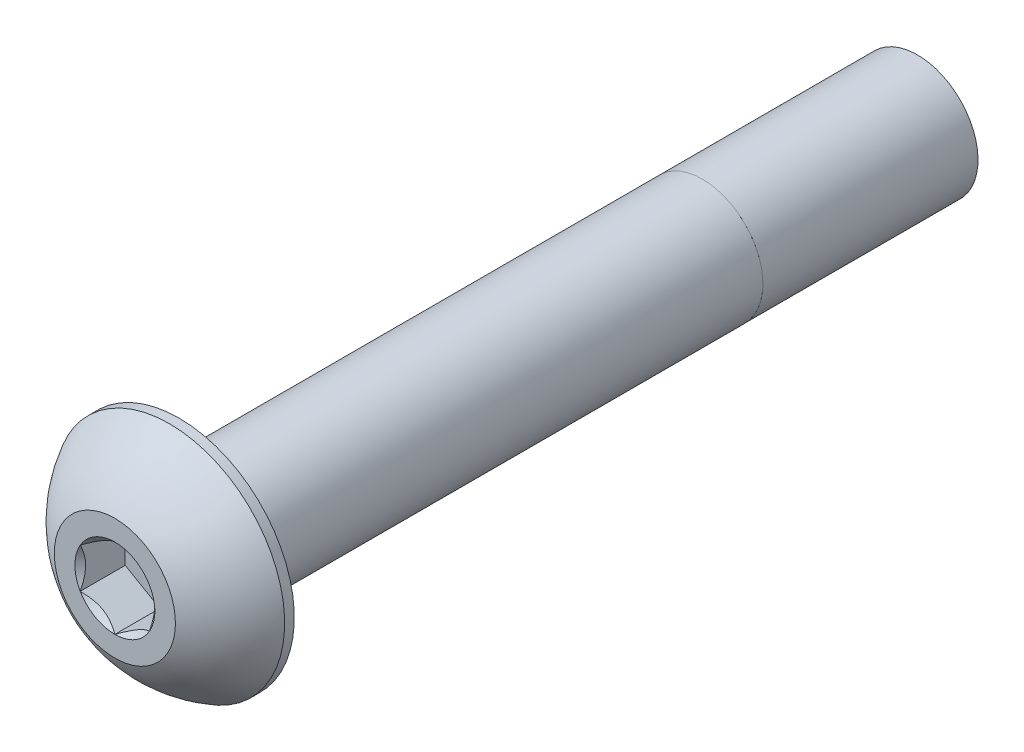
ISO-10303-21;
HEADER;
FILE_DESCRIPTION(('STEP AP214'),'2;1');
FILE_NAME('part.step','',(''),(''),'','','');
FILE_SCHEMA(('AUTOMOTIVE_DESIGN { 1 0 10303 214 1 1 1 1 }'));
ENDSEC;
DATA;
#1=APPLICATION_CONTEXT('core data for automotive mechanical design processes');
#2=APPLICATION_PROTOCOL_DEFINITION('international standard','automotive_design',2000,#1);
#3=PRODUCT_CONTEXT('',#1,'mechanical');
#4=PRODUCT('Part','Part','',(#3));
#5=PRODUCT_RELATED_PRODUCT_CATEGORY('part','',(#4));
#6=PRODUCT_DEFINITION_FORMATION('','',#4);
#7=PRODUCT_DEFINITION_CONTEXT('part definition',#1,'design');
#8=PRODUCT_DEFINITION('design','',#6,#7);
#9=PRODUCT_DEFINITION_SHAPE('','',#8);
#10=(LENGTH_UNIT() NAMED_UNIT(*) SI_UNIT(.MILLI.,.METRE.));
#11=(NAMED_UNIT(*) PLANE_ANGLE_UNIT() SI_UNIT($,.RADIAN.));
#12=(NAMED_UNIT(*) SI_UNIT($,.STERADIAN.) SOLID_ANGLE_UNIT());
#13=UNCERTAINTY_MEASURE_WITH_UNIT(LENGTH_MEASURE(1.E-05),#10,'distance_accuracy_value','');
#14=(GEOMETRIC_REPRESENTATION_CONTEXT(3) GLOBAL_UNCERTAINTY_ASSIGNED_CONTEXT((#13)) GLOBAL_UNIT_ASSIGNED_CONTEXT((#10,
#11,#12)) REPRESENTATION_CONTEXT('',''));
#15=CARTESIAN_POINT('',(0.,0.,0.));
#16=DIRECTION('',(0.,0.,1.));
#17=DIRECTION('',(1.,0.,0.));
#18=AXIS2_PLACEMENT_3D('',#15,#16,#17);
#19=CARTESIAN_POINT('',(0.,0.,-5.300000068));
#20=DIRECTION('',(0.,0.,-1.));
#21=DIRECTION('',(0.,1.,0.));
#22=AXIS2_PLACEMENT_3D('',#19,#20,#21);
#23=PLANE('',#22);
#24=CARTESIAN_POINT('',(0.,0.,-5.300000068));
#25=DIRECTION('',(0.,0.,-1.));
#26=DIRECTION('',(0.,1.,0.));
#27=AXIS2_PLACEMENT_3D('',#24,#25,#26);
#28=CIRCLE('',#27,2.0828);
#29=CARTESIAN_POINT('',(0.,2.08279999999999,-5.300000068));
#30=VERTEX_POINT('',#29);
#31=EDGE_CURVE('E62',#30,#30,#28,.T.);
#32=ORIENTED_EDGE('',*,*,#31,.T.);
#33=EDGE_LOOP('',(#32));
#34=FACE_BOUND('',#33,.T.);
#35=ADVANCED_FACE('F58',(#34),#23,.T.);
#36=CARTESIAN_POINT('',(0.,0.,14.9098));
#37=DIRECTION('',(0.,0.,1.));
#38=DIRECTION('',(0.,-1.,0.));
#39=AXIS2_PLACEMENT_3D('',#36,#37,#38);
#40=CYLINDRICAL_SURFACE('',#39,2.0828);
#41=CARTESIAN_POINT('',(0.,0.,12.7));
#42=DIRECTION('',(0.,0.,-1.));
#43=DIRECTION('',(-1.,0.,0.));
#44=AXIS2_PLACEMENT_3D('',#41,#42,#43);
#45=CIRCLE('',#44,2.08279999999999);
#46=CARTESIAN_POINT('',(-2.08279999999999,0.,12.7));
#47=VERTEX_POINT('',#46);
#48=EDGE_CURVE('E12',#47,#47,#45,.T.);
#49=ORIENTED_EDGE('',*,*,#48,.T.);
#50=EDGE_LOOP('',(#49));
#51=FACE_BOUND('',#50,.T.);
#52=ORIENTED_EDGE('',*,*,#31,.F.);
#53=EDGE_LOOP('',(#52));
#54=FACE_BOUND('',#53,.T.);
#55=ADVANCED_FACE('F60',(#51,#54),#40,.T.);
#56=CARTESIAN_POINT('',(0.,-3.96240000000001,12.7));
#57=DIRECTION('',(0.,0.,-1.));
#58=DIRECTION('',(0.,1.,0.));
#59=AXIS2_PLACEMENT_3D('',#56,#57,#58);
#60=PLANE('',#59);
#61=ORIENTED_EDGE('',*,*,#48,.F.);
#62=EDGE_LOOP('',(#61));
#63=FACE_BOUND('',#62,.T.);
#64=ADVANCED_FACE('F76',(#63),#60,.F.);
#65=CLOSED_SHELL('',(#35,#55,#64));
#66=MANIFOLD_SOLID_BREP('B2',#65);
#67=CARTESIAN_POINT('',(0.,0.,-5.300000068));
#68=DIRECTION('',(0.,0.,-1.));
#69=DIRECTION('',(0.,1.,0.));
#70=AXIS2_PLACEMENT_3D('',#67,#68,#69);
#71=PLANE('',#70);
#72=CARTESIAN_POINT('',(0.,0.,-5.300000068));
#73=DIRECTION('',(0.,0.,-1.));
#74=DIRECTION('',(0.,1.,0.));
#75=AXIS2_PLACEMENT_3D('',#72,#73,#74);
#76=CIRCLE('',#75,2.0828);
#77=CARTESIAN_POINT('',(0.,2.08279999999999,-5.300000068));
#78=VERTEX_POINT('',#77);
#79=EDGE_CURVE('E57',#78,#78,#76,.T.);
#80=ORIENTED_EDGE('',*,*,#79,.F.);
#81=EDGE_LOOP('',(#80));
#82=FACE_BOUND('',#81,.T.);
#83=ADVANCED_FACE('F113',(#82),#71,.F.);
#84=CARTESIAN_POINT('',(0.,2.08279999999999,-12.7));
#85=DIRECTION('',(0.,0.,1.));
#86=DIRECTION('',(0.,-1.,0.));
#87=AXIS2_PLACEMENT_3D('',#84,#85,#86);
#88=PLANE('',#87);
#89=CARTESIAN_POINT('',(0.,0.,-12.7));
#90=DIRECTION('',(0.,0.,1.));
#91=DIRECTION('',(0.,-1.,0.));
#92=AXIS2_PLACEMENT_3D('',#89,#90,#91);
#93=CIRCLE('',#92,2.0828);
#94=CARTESIAN_POINT('',(0.,-2.0828,-12.7));
#95=VERTEX_POINT('',#94);
#96=EDGE_CURVE('E119',#95,#95,#93,.T.);
#97=ORIENTED_EDGE('',*,*,#96,.F.);
#98=EDGE_LOOP('',(#97));
#99=FACE_BOUND('',#98,.T.);
#100=ADVANCED_FACE('F128',(#99),#88,.F.);
#101=CARTESIAN_POINT('',(0.,0.,14.9098));
#102=DIRECTION('',(0.,0.,1.));
#103=DIRECTION('',(0.,-1.,0.));
#104=AXIS2_PLACEMENT_3D('',#101,#102,#103);
#105=CYLINDRICAL_SURFACE('',#104,2.0828);
#106=ORIENTED_EDGE('',*,*,#79,.T.);
#107=EDGE_LOOP('',(#106));
#108=FACE_BOUND('',#107,.T.);
#109=ORIENTED_EDGE('',*,*,#96,.T.);
#110=EDGE_LOOP('',(#109));
#111=FACE_BOUND('',#110,.T.);
#112=ADVANCED_FACE('F126',(#108,#111),#105,.T.);
#113=CLOSED_SHELL('',(#83,#100,#112));
#114=MANIFOLD_SOLID_BREP('B7',#113);
#115=CARTESIAN_POINT('',(0.,-3.96240000000001,12.7));
#116=DIRECTION('',(0.,0.,-1.));
#117=DIRECTION('',(0.,1.,0.));
#118=AXIS2_PLACEMENT_3D('',#115,#116,#117);
#119=PLANE('',#118);
#120=CARTESIAN_POINT('',(0.,0.,12.7));
#121=DIRECTION('',(0.,0.,1.));
#122=DIRECTION('',(0.,-1.,0.));
#123=AXIS2_PLACEMENT_3D('',#120,#121,#122);
#124=CIRCLE('',#123,3.9624);
#125=CARTESIAN_POINT('',(0.,-3.96240000000001,12.7));
#126=VERTEX_POINT('',#125);
#127=EDGE_CURVE('E174',#126,#126,#124,.T.);
#128=ORIENTED_EDGE('',*,*,#127,.F.);
#129=EDGE_LOOP('',(#128));
#130=FACE_BOUND('',#129,.T.);
#131=ADVANCED_FACE('F160',(#130),#119,.T.);
#132=CARTESIAN_POINT('',(1.19062499999999,-0.687407664253894,13.36294));
#133=DIRECTION('',(0.,0.,1.));
#134=DIRECTION('',(1.,0.,0.));
#135=AXIS2_PLACEMENT_3D('',#132,#133,#134);
#136=PLANE('',#135);
#137=DIRECTION('',(0.866025403784438,0.5,0.));
#138=VECTOR('',#137,1.);
#139=CARTESIAN_POINT('',(0.,-1.37481532850779,13.36294));
#140=LINE('',#139,#138);
#141=CARTESIAN_POINT('',(0.,-1.37481532850779,13.36294));
#142=VERTEX_POINT('',#141);
#143=CARTESIAN_POINT('',(1.19062499999999,-0.687407664253894,13.36294));
#144=VERTEX_POINT('',#143);
#145=EDGE_CURVE('E244',#142,#144,#140,.T.);
#146=ORIENTED_EDGE('',*,*,#145,.T.);
#147=DIRECTION('',(0.,1.,0.));
#148=VECTOR('',#147,1.);
#149=CARTESIAN_POINT('',(1.19062499999999,-0.687407664253894,13.36294));
#150=LINE('',#149,#148);
#151=CARTESIAN_POINT('',(1.19062499999999,0.687407664253892,13.36294));
#152=VERTEX_POINT('',#151);
#153=EDGE_CURVE('E249',#144,#152,#150,.T.);
#154=ORIENTED_EDGE('',*,*,#153,.T.);
#155=DIRECTION('',(-0.866025403784439,0.5,0.));
#156=VECTOR('',#155,1.);
#157=CARTESIAN_POINT('',(1.19062499999999,0.687407664253892,13.36294));
#158=LINE('',#157,#156);
#159=CARTESIAN_POINT('',(0.,1.37481532850779,13.36294));
#160=VERTEX_POINT('',#159);
#161=EDGE_CURVE('E393',#152,#160,#158,.T.);
#162=ORIENTED_EDGE('',*,*,#161,.T.);
#163=DIRECTION('',(-0.866025403784439,-0.5,0.));
#164=VECTOR('',#163,1.);
#165=CARTESIAN_POINT('',(0.,1.37481532850779,13.36294));
#166=LINE('',#165,#164);
#167=CARTESIAN_POINT('',(-1.19062499999999,0.687407664253891,13.36294));
#168=VERTEX_POINT('',#167);
#169=EDGE_CURVE('E395',#160,#168,#166,.T.);
#170=ORIENTED_EDGE('',*,*,#169,.T.);
#171=DIRECTION('',(0.,-1.,0.));
#172=VECTOR('',#171,1.);
#173=CARTESIAN_POINT('',(-1.19062499999999,0.687407664253891,13.36294));
#174=LINE('',#173,#172);
#175=CARTESIAN_POINT('',(-1.19062499999999,-0.687407664253897,13.36294));
#176=VERTEX_POINT('',#175);
#177=EDGE_CURVE('E295',#168,#176,#174,.T.);
#178=ORIENTED_EDGE('',*,*,#177,.T.);
#179=DIRECTION('',(0.866025403784439,-0.499999999999999,0.));
#180=VECTOR('',#179,1.);
#181=CARTESIAN_POINT('',(-1.19062499999999,-0.687407664253897,13.36294));
#182=LINE('',#181,#180);
#183=EDGE_CURVE('E253',#176,#142,#182,.T.);
#184=ORIENTED_EDGE('',*,*,#183,.T.);
#185=EDGE_LOOP('',(#146,#154,#162,#170,#178,#184));
#186=FACE_BOUND('',#185,.T.);
#187=ADVANCED_FACE('F322',(#186),#136,.T.);
#188=CARTESIAN_POINT('',(-1.19062499999999,0.687407664253891,13.36294));
#189=DIRECTION('',(-1.,0.,0.));
#190=DIRECTION('',(0.,-1.,0.));
#191=AXIS2_PLACEMENT_3D('',#188,#189,#190);
#192=PLANE('',#191);
#193=DIRECTION('',(0.,0.,1.));
#194=VECTOR('',#193,1.);
#195=CARTESIAN_POINT('',(-1.19062499999999,0.687407664253891,13.36294));
#196=LINE('',#195,#194);
#197=CARTESIAN_POINT('',(-1.19062499999999,0.687407664253891,14.9098));
#198=VERTEX_POINT('',#197);
#199=EDGE_CURVE('E288',#168,#198,#196,.T.);
#200=ORIENTED_EDGE('',*,*,#199,.T.);
#201=CARTESIAN_POINT('',(-1.19062499999999,-1.37097145294693,15.3507904472899));
#202=CARTESIAN_POINT('',(-1.19062499999999,-1.33758920637889,15.3255899888078));
#203=CARTESIAN_POINT('',(-1.19062499999999,-1.30402095496658,15.3006366202374));
#204=CARTESIAN_POINT('',(-1.19062499999999,-1.23643692297761,15.2513260871772));
#205=CARTESIAN_POINT('',(-1.19062499999999,-1.20242103219111,15.2269690738994));
#206=CARTESIAN_POINT('',(-1.19062499999999,-1.09909081482554,15.1545982089892));
#207=CARTESIAN_POINT('',(-1.19062499999999,-1.02900143506766,15.1076726225956));
#208=CARTESIAN_POINT('',(-1.19062499999999,-0.882026737424226,15.0155521033256));
#209=CARTESIAN_POINT('',(-1.19062499999999,-0.804981866019978,14.9706088372421));
#210=CARTESIAN_POINT('',(-1.19062499999999,-0.647043893307964,14.8883980245069));
#211=CARTESIAN_POINT('',(-1.19062499999999,-0.56616494370292,14.8511046017321));
#212=CARTESIAN_POINT('',(-1.19062499999999,-0.444764933868856,14.8054795555631));
#213=CARTESIAN_POINT('',(-1.19062499999999,-0.406041211486714,14.7923848390215));
#214=CARTESIAN_POINT('',(-1.19062499999999,-0.327658904711934,14.7693042758966));
#215=CARTESIAN_POINT('',(-1.19062499999999,-0.288000256118253,14.759318643486));
#216=CARTESIAN_POINT('',(-1.19062499999999,-0.208647693212099,14.7431412290653));
#217=CARTESIAN_POINT('',(-1.19062499999999,-0.168967240621964,14.736884445849));
#218=CARTESIAN_POINT('',(-1.19062499999999,-0.0891819742965358,14.7282868884185));
#219=CARTESIAN_POINT('',(-1.19062499999999,-0.0490772347013152,14.7259454410499));
#220=CARTESIAN_POINT('',(-1.19062499999999,0.0297075773931733,14.7253522440677));
#221=CARTESIAN_POINT('',(-1.19062499999999,0.0683866068288052,14.7269553537961));
#222=CARTESIAN_POINT('',(-1.19062499999999,0.145416876633146,14.7338430277445));
#223=CARTESIAN_POINT('',(-1.19062499999999,0.183768052740674,14.7391282976685));
#224=CARTESIAN_POINT('',(-1.19062499999999,0.260508634904939,14.7531814122329));
#225=CARTESIAN_POINT('',(-1.19062499999999,0.298887052039127,14.7620083626058));
#226=CARTESIAN_POINT('',(-1.19062499999999,0.374805334250657,14.7826757099806));
#227=CARTESIAN_POINT('',(-1.19062499999999,0.412345269207088,14.7945158548359));
#228=CARTESIAN_POINT('',(-1.19062499999999,0.530535580908832,14.8362473336672));
#229=CARTESIAN_POINT('',(-1.19062499999999,0.609503725744438,14.8708913969143));
#230=CARTESIAN_POINT('',(-1.19062499999999,0.763730269113457,14.9479182519749));
#231=CARTESIAN_POINT('',(-1.19062499999999,0.838974064674596,14.9903288466687));
#232=CARTESIAN_POINT('',(-1.19062499999999,0.982775796189608,15.077825645025));
#233=CARTESIAN_POINT('',(-1.19062499999999,1.05148016607043,15.1226741620552));
#234=CARTESIAN_POINT('',(-1.19062499999999,1.15270222256252,15.1920053299226));
#235=CARTESIAN_POINT('',(-1.19062499999999,1.18600604145833,15.2153601763372));
#236=CARTESIAN_POINT('',(-1.19062499999999,1.2521586036223,15.2626875690193));
#237=CARTESIAN_POINT('',(-1.19062499999999,1.28500746868277,15.2866599448583));
#238=CARTESIAN_POINT('',(-1.19062499999999,1.31766689427972,15.3108883667713));
#239=B_SPLINE_CURVE_WITH_KNOTS('',3,(#201,#202,#203,#204,#205,#206,#207,#208,#209,#210,#211,
#212,#213,#214,#215,#216,#217,#218,#219,#220,#221,#222,#223,#224,#225,#226,#227,#228,#229,#230,
#231,#232,#233,#234,#235,#236,#237,#238),.UNSPECIFIED.,.F.,.F.,(4,2,2,2,2,2,2,2,2,2,2,2,2,2,2,2,
2,2,4),(0.,0.125475644763329,0.250982782413966,0.50391251876917,0.771279184643219,
1.03772598255656,1.16025581644628,1.28279408906664,1.40312855503245,1.52344233005029,
1.63939577664876,1.75537145240476,1.87336894094837,1.99135655861151,2.24929724983447,
2.50818004711561,2.75419821472194,2.87622362118595,2.99821570388959),.UNSPECIFIED.);
#240=CARTESIAN_POINT('',(-1.19062499999999,-0.6874076642539,14.9098));
#241=VERTEX_POINT('',#240);
#242=EDGE_CURVE('E278',#198,#241,#239,.F.);
#243=ORIENTED_EDGE('',*,*,#242,.T.);
#244=DIRECTION('',(0.,0.,1.));
#245=VECTOR('',#244,1.);
#246=CARTESIAN_POINT('',(-1.19062499999999,-0.687407664253897,13.36294));
#247=LINE('',#246,#245);
#248=EDGE_CURVE('E298',#176,#241,#247,.T.);
#249=ORIENTED_EDGE('',*,*,#248,.F.);
#250=ORIENTED_EDGE('',*,*,#177,.F.);
#251=EDGE_LOOP('',(#200,#243,#249,#250));
#252=FACE_BOUND('',#251,.T.);
#253=ADVANCED_FACE('F293',(#252),#192,.F.);
#254=CARTESIAN_POINT('',(-1.19062499999999,-0.687407664253897,13.36294));
#255=DIRECTION('',(-0.499999999999999,-0.866025403784439,0.));
#256=DIRECTION('',(0.866025403784439,-0.499999999999999,0.));
#257=AXIS2_PLACEMENT_3D('',#254,#255,#256);
#258=PLANE('',#257);
#259=ORIENTED_EDGE('',*,*,#248,.T.);
#260=CARTESIAN_POINT('',(-1.19082499999999,-0.687292194200059,14.9099154846));
#261=CARTESIAN_POINT('',(-1.14989058041014,-0.710925692369384,14.8862987642143));
#262=CARTESIAN_POINT('',(-1.10827161169802,-0.73495441515872,14.8640687817231));
#263=CARTESIAN_POINT('',(-1.02340555632636,-0.783951855072608,14.8233656626274));
#264=CARTESIAN_POINT('',(-0.980150392709033,-0.808925235430913,14.8049151826475));
#265=CARTESIAN_POINT('',(-0.892928352542569,-0.859282903800289,14.7733088380043));
#266=CARTESIAN_POINT('',(-0.848983705042069,-0.884654357864146,14.7600735042433));
#267=CARTESIAN_POINT('',(-0.7601266258363,-0.935956016463,14.7396814515754));
#268=CARTESIAN_POINT('',(-0.715216911165239,-0.961884652317567,14.732509502896));
#269=CARTESIAN_POINT('',(-0.637820872343016,-1.00656927616579,14.7260385386489));
#270=CARTESIAN_POINT('',(-0.605434587484348,-1.02526750644699,14.7250803201468));
#271=CARTESIAN_POINT('',(-0.540718926682225,-1.06263111063188,14.7266926490721));
#272=CARTESIAN_POINT('',(-0.508389564872722,-1.08129647637533,14.7292639751796));
#273=CARTESIAN_POINT('',(-0.444042843928511,-1.11844707303394,14.7377867539936));
#274=CARTESIAN_POINT('',(-0.412025803663228,-1.13693211984975,14.7437413547526));
#275=CARTESIAN_POINT('',(-0.348526236603539,-1.17359361198509,14.7587099640712));
#276=CARTESIAN_POINT('',(-0.317043945355832,-1.19176992131166,14.7677252859121));
#277=CARTESIAN_POINT('',(-0.23641016142787,-1.23832385816825,14.794482295838));
#278=CARTESIAN_POINT('',(-0.18776716473234,-1.2664079054046,14.814236814436));
#279=CARTESIAN_POINT('',(-0.0923855836478805,-1.32147648691945,14.8587367689577));
#280=CARTESIAN_POINT('',(-0.0456413824128445,-1.34846426408555,14.8834659647162));
#281=CARTESIAN_POINT('',(0.000199999999999535,-1.37493079856163,14.9099154846));
#282=B_SPLINE_CURVE_WITH_KNOTS('',3,(#260,#261,#262,#263,#264,#265,#266,#267,#268,#269,#270,
#271,#272,#273,#274,#275,#276,#277,#278,#279,#280,#281),.UNSPECIFIED.,.F.,.F.,(4,2,2,2,2,2,2,2,
2,2,4),(0.,0.15862567293412,0.31817607984327,0.475191357500653,0.631811068630746,
0.743878551794715,0.855970763007025,0.968167444423238,1.08041232768376,1.25873351645466,
1.43648174479846),.UNSPECIFIED.);
#283=CARTESIAN_POINT('',(0.,-1.37481532850779,14.9098));
#284=VERTEX_POINT('',#283);
#285=EDGE_CURVE('E245',#241,#284,#282,.T.);
#286=ORIENTED_EDGE('',*,*,#285,.T.);
#287=DIRECTION('',(0.,0.,1.));
#288=VECTOR('',#287,1.);
#289=CARTESIAN_POINT('',(0.,-1.37481532850779,13.36294));
#290=LINE('',#289,#288);
#291=EDGE_CURVE('E242',#142,#284,#290,.T.);
#292=ORIENTED_EDGE('',*,*,#291,.F.);
#293=ORIENTED_EDGE('',*,*,#183,.F.);
#294=EDGE_LOOP('',(#259,#286,#292,#293));
#295=FACE_BOUND('',#294,.T.);
#296=ADVANCED_FACE('F342',(#295),#258,.F.);
#297=CARTESIAN_POINT('',(0.,-1.37481532850779,13.36294));
#298=DIRECTION('',(0.5,-0.866025403784439,0.));
#299=DIRECTION('',(0.866025403784439,0.5,0.));
#300=AXIS2_PLACEMENT_3D('',#297,#298,#299);
#301=PLANE('',#300);
#302=ORIENTED_EDGE('',*,*,#291,.T.);
#303=CARTESIAN_POINT('',(-0.000200000000000348,-1.37493079856163,14.9099154846));
#304=CARTESIAN_POINT('',(0.0407344195898562,-1.3512973003923,14.8862987642143));
#305=CARTESIAN_POINT('',(0.0823533883019733,-1.32726857760297,14.8640687817231));
#306=CARTESIAN_POINT('',(0.167219443673631,-1.27827113768908,14.8233656626274));
#307=CARTESIAN_POINT('',(0.210474607290959,-1.25329775733077,14.8049151826476));
#308=CARTESIAN_POINT('',(0.297696647457422,-1.2029400889614,14.7733088380043));
#309=CARTESIAN_POINT('',(0.341641294957922,-1.17756863489754,14.7600735042433));
#310=CARTESIAN_POINT('',(0.43049837416369,-1.12626697629869,14.7396814515754));
#311=CARTESIAN_POINT('',(0.475408088834751,-1.10033834044412,14.732509502896));
#312=CARTESIAN_POINT('',(0.552804127656974,-1.0556537165959,14.7260385386489));
#313=CARTESIAN_POINT('',(0.585190412515642,-1.0369554863147,14.7250803201468));
#314=CARTESIAN_POINT('',(0.649906073317764,-0.999591882129805,14.7266926490721));
#315=CARTESIAN_POINT('',(0.682235435127267,-0.98092651638636,14.7292639751796));
#316=CARTESIAN_POINT('',(0.746582156071478,-0.94377591972775,14.7377867539936));
#317=CARTESIAN_POINT('',(0.778599196336761,-0.925290872911934,14.7437413547526));
#318=CARTESIAN_POINT('',(0.84209876339645,-0.888629380776598,14.7587099640712));
#319=CARTESIAN_POINT('',(0.873581054644157,-0.870453071450028,14.7677252859121));
#320=CARTESIAN_POINT('',(0.95421483857212,-0.82389913459344,14.794482295838));
#321=CARTESIAN_POINT('',(1.00285783526765,-0.795815087357085,14.814236814436));
#322=CARTESIAN_POINT('',(1.09823941635211,-0.740746505842239,14.8587367689577));
#323=CARTESIAN_POINT('',(1.14498361758715,-0.713758728676137,14.8834659647162));
#324=CARTESIAN_POINT('',(1.19082499999999,-0.687292194200056,14.9099154846));
#325=B_SPLINE_CURVE_WITH_KNOTS('',3,(#303,#304,#305,#306,#307,#308,#309,#310,#311,#312,#313,
#314,#315,#316,#317,#318,#319,#320,#321,#322,#323,#324),.UNSPECIFIED.,.F.,.F.,(4,2,2,2,2,2,2,2,
2,2,4),(0.,0.158625672934119,0.318176079843269,0.475191357500652,0.631811068630744,
0.743878551794713,0.855970763007022,0.968167444423234,1.08041232768376,1.25873351645466,
1.43648174479846),.UNSPECIFIED.);
#326=CARTESIAN_POINT('',(1.19062499999999,-0.687407664253896,14.9098));
#327=VERTEX_POINT('',#326);
#328=EDGE_CURVE('E223',#284,#327,#325,.T.);
#329=ORIENTED_EDGE('',*,*,#328,.T.);
#330=DIRECTION('',(0.,0.,1.));
#331=VECTOR('',#330,1.);
#332=CARTESIAN_POINT('',(1.19062499999999,-0.687407664253894,13.36294));
#333=LINE('',#332,#331);
#334=EDGE_CURVE('E240',#144,#327,#333,.T.);
#335=ORIENTED_EDGE('',*,*,#334,.F.);
#336=ORIENTED_EDGE('',*,*,#145,.F.);
#337=EDGE_LOOP('',(#302,#329,#335,#336));
#338=FACE_BOUND('',#337,.T.);
#339=ADVANCED_FACE('F238',(#338),#301,.F.);
#340=CARTESIAN_POINT('',(1.19062499999999,-0.687407664253894,13.36294));
#341=DIRECTION('',(1.,0.,0.));
#342=DIRECTION('',(0.,1.,0.));
#343=AXIS2_PLACEMENT_3D('',#340,#341,#342);
#344=PLANE('',#343);
#345=ORIENTED_EDGE('',*,*,#334,.T.);
#346=CARTESIAN_POINT('',(1.19062499999999,-1.37097145314639,15.3507904474405));
#347=CARTESIAN_POINT('',(1.19062499999999,-1.33758920657276,15.3255899889526));
#348=CARTESIAN_POINT('',(1.19062499999999,-1.30402095515483,15.3006366203765));
#349=CARTESIAN_POINT('',(1.19062499999999,-1.23643692315458,15.2513260873047));
#350=CARTESIAN_POINT('',(1.19062499999999,-1.20242103236241,15.2269690740211));
#351=CARTESIAN_POINT('',(1.19062499999999,-1.09909081497948,15.1545982090935));
#352=CARTESIAN_POINT('',(1.19062499999999,-1.0290014352098,15.1076726226883));
#353=CARTESIAN_POINT('',(1.19062499999999,-0.882026737540626,15.0155521033947));
#354=CARTESIAN_POINT('',(1.19062499999999,-0.804981866122371,14.970608837299));
#355=CARTESIAN_POINT('',(1.19062499999999,-0.647043893381151,14.8883980245414));
#356=CARTESIAN_POINT('',(1.19062499999999,-0.56616494376092,14.8511046017562));
#357=CARTESIAN_POINT('',(1.19062499999999,-0.444764933915429,14.8054795555795));
#358=CARTESIAN_POINT('',(1.19062499999999,-0.406041211538072,14.7923848390382));
#359=CARTESIAN_POINT('',(1.19062499999999,-0.32765890477302,14.769304275913));
#360=CARTESIAN_POINT('',(1.19062499999999,-0.288000256184282,14.7593186435017));
#361=CARTESIAN_POINT('',(1.19062499999999,-0.208647693287848,14.7431412290785));
#362=CARTESIAN_POINT('',(1.19062499999999,-0.16896724070249,14.7368844458605));
#363=CARTESIAN_POINT('',(1.19062499999999,-0.0891819743864555,14.7282868884254));
#364=CARTESIAN_POINT('',(1.19062499999999,-0.0490772347958517,14.7259454410539));
#365=CARTESIAN_POINT('',(1.19062499999999,0.029707577290121,14.7253522440652));
#366=CARTESIAN_POINT('',(1.19062499999999,0.0683866067218424,14.72695535379));
#367=CARTESIAN_POINT('',(1.19062499999999,0.145416876518748,14.7338430277307));
#368=CARTESIAN_POINT('',(1.19062499999999,0.183768052622752,14.7391282976506));
#369=CARTESIAN_POINT('',(1.19062499999999,0.260508634780062,14.7531814122063));
#370=CARTESIAN_POINT('',(1.19062499999999,0.298887051910829,14.7620083625746));
#371=CARTESIAN_POINT('',(1.19062499999999,0.37480533411585,14.7826757099402));
#372=CARTESIAN_POINT('',(1.19062499999999,0.41234526906919,14.7945158547908));
#373=CARTESIAN_POINT('',(1.19062499999999,0.530535580740907,14.8362473336));
#374=CARTESIAN_POINT('',(1.19062499999999,0.609503725551082,14.8708913968269));
#375=CARTESIAN_POINT('',(1.19062499999999,0.763730268871188,14.9479182518447));
#376=CARTESIAN_POINT('',(1.19062499999999,0.838974064408859,14.9903288465159));
#377=CARTESIAN_POINT('',(1.19062499999999,0.982775795881679,15.0778256448291));
#378=CARTESIAN_POINT('',(1.19062499999999,1.05148016574363,15.122674161839));
#379=CARTESIAN_POINT('',(1.19062499999999,1.15270222220781,15.1920053296759));
#380=CARTESIAN_POINT('',(1.19062499999999,1.18600604109445,15.2153601760804));
#381=CARTESIAN_POINT('',(1.19062499999999,1.25215860324014,15.2626875687424));
#382=CARTESIAN_POINT('',(1.19062499999999,1.28500746829151,15.2866599445713));
#383=CARTESIAN_POINT('',(1.19062499999999,1.31766689387936,15.3108883664742));
#384=B_SPLINE_CURVE_WITH_KNOTS('',3,(#346,#347,#348,#349,#350,#351,#352,#353,#354,#355,#356,
#357,#358,#359,#360,#361,#362,#363,#364,#365,#366,#367,#368,#369,#370,#371,#372,#373,#374,#375,
#376,#377,#378,#379,#380,#381,#382,#383),.UNSPECIFIED.,.F.,.F.,(4,2,2,2,2,2,2,2,2,2,2,2,2,2,2,2,
2,2,4),(0.,0.125475644787211,0.250982782461738,0.503912518865614,0.771279184794244,
1.03772598276165,1.16025581663754,1.28279408924408,1.40312855519664,1.52344233020122,
1.63939577678757,1.75537145253143,1.87336894106197,1.99135655871205,2.24929724984112,
2.50818004702775,2.75419821455321,2.87622362097733,2.99821570364109),.UNSPECIFIED.);
#385=CARTESIAN_POINT('',(1.19062499999999,0.687407664253891,14.9098));
#386=VERTEX_POINT('',#385);
#387=EDGE_CURVE('E111',#327,#386,#384,.T.);
#388=ORIENTED_EDGE('',*,*,#387,.T.);
#389=DIRECTION('',(0.,0.,1.));
#390=VECTOR('',#389,1.);
#391=CARTESIAN_POINT('',(1.19062499999999,0.687407664253892,13.36294));
#392=LINE('',#391,#390);
#393=EDGE_CURVE('E252',#152,#386,#392,.T.);
#394=ORIENTED_EDGE('',*,*,#393,.F.);
#395=ORIENTED_EDGE('',*,*,#153,.F.);
#396=EDGE_LOOP('',(#345,#388,#394,#395));
#397=FACE_BOUND('',#396,.T.);
#398=ADVANCED_FACE('F247',(#397),#344,.F.);
#399=CARTESIAN_POINT('',(1.19062499999999,0.687407664253892,13.36294));
#400=DIRECTION('',(0.5,0.866025403784439,0.));
#401=DIRECTION('',(-0.866025403784439,0.5,0.));
#402=AXIS2_PLACEMENT_3D('',#399,#400,#401);
#403=PLANE('',#402);
#404=ORIENTED_EDGE('',*,*,#393,.T.);
#405=CARTESIAN_POINT('',(1.19082499999999,0.687292194200054,14.9099154846));
#406=CARTESIAN_POINT('',(1.14989058041014,0.710925692369378,14.8862987642143));
#407=CARTESIAN_POINT('',(1.10827161169802,0.734954415158714,14.8640687817231));
#408=CARTESIAN_POINT('',(1.02340555632636,0.783951855072602,14.8233656626274));
#409=CARTESIAN_POINT('',(0.980150392709034,0.808925235430908,14.8049151826476));
#410=CARTESIAN_POINT('',(0.892928352542571,0.859282903800284,14.7733088380043));
#411=CARTESIAN_POINT('',(0.848983705042071,0.884654357864141,14.7600735042433));
#412=CARTESIAN_POINT('',(0.760126625836302,0.935956016462995,14.7396814515754));
#413=CARTESIAN_POINT('',(0.715216911165241,0.961884652317561,14.732509502896));
#414=CARTESIAN_POINT('',(0.637820872343019,1.00656927616578,14.7260385386489));
#415=CARTESIAN_POINT('',(0.605434587484351,1.02526750644699,14.7250803201468));
#416=CARTESIAN_POINT('',(0.540718926682228,1.06263111063188,14.7266926490721));
#417=CARTESIAN_POINT('',(0.508389564872725,1.08129647637532,14.7292639751796));
#418=CARTESIAN_POINT('',(0.444042843928513,1.11844707303393,14.7377867539936));
#419=CARTESIAN_POINT('',(0.41202580366323,1.13693211984975,14.7437413547526));
#420=CARTESIAN_POINT('',(0.348526236603541,1.17359361198508,14.7587099640712));
#421=CARTESIAN_POINT('',(0.317043945355834,1.19176992131165,14.7677252859121));
#422=CARTESIAN_POINT('',(0.236410161427872,1.23832385816824,14.794482295838));
#423=CARTESIAN_POINT('',(0.187767164732341,1.2664079054046,14.814236814436));
#424=CARTESIAN_POINT('',(0.0923855836478813,1.32147648691944,14.8587367689577));
#425=CARTESIAN_POINT('',(0.0456413824128451,1.34846426408554,14.8834659647162));
#426=CARTESIAN_POINT('',(-0.000199999999999001,1.37493079856162,14.9099154846));
#427=B_SPLINE_CURVE_WITH_KNOTS('',3,(#405,#406,#407,#408,#409,#410,#411,#412,#413,#414,#415,
#416,#417,#418,#419,#420,#421,#422,#423,#424,#425,#426),.UNSPECIFIED.,.F.,.F.,(4,2,2,2,2,2,2,2,
2,2,4),(0.,0.15862567293412,0.318176079843269,0.475191357500653,0.631811068630745,
0.743878551794714,0.855970763007024,0.968167444423237,1.08041232768376,1.25873351645466,
1.43648174479846),.UNSPECIFIED.);
#428=CARTESIAN_POINT('',(0.,1.37481532850779,14.9098));
#429=VERTEX_POINT('',#428);
#430=EDGE_CURVE('E264',#386,#429,#427,.T.);
#431=ORIENTED_EDGE('',*,*,#430,.T.);
#432=DIRECTION('',(0.,0.,1.));
#433=VECTOR('',#432,1.);
#434=CARTESIAN_POINT('',(0.,1.37481532850779,13.36294));
#435=LINE('',#434,#433);
#436=EDGE_CURVE('E290',#160,#429,#435,.T.);
#437=ORIENTED_EDGE('',*,*,#436,.F.);
#438=ORIENTED_EDGE('',*,*,#161,.F.);
#439=EDGE_LOOP('',(#404,#431,#437,#438));
#440=FACE_BOUND('',#439,.T.);
#441=ADVANCED_FACE('F384',(#440),#403,.F.);
#442=CARTESIAN_POINT('',(0.,1.37481532850779,13.36294));
#443=DIRECTION('',(-0.5,0.866025403784439,0.));
#444=DIRECTION('',(-0.866025403784439,-0.5,0.));
#445=AXIS2_PLACEMENT_3D('',#442,#443,#444);
#446=PLANE('',#445);
#447=ORIENTED_EDGE('',*,*,#436,.T.);
#448=CARTESIAN_POINT('',(0.000200000000000734,1.37493079856162,14.9099154846));
#449=CARTESIAN_POINT('',(-0.0407344195898556,1.3512973003923,14.8862987642143));
#450=CARTESIAN_POINT('',(-0.0823533883019729,1.32726857760296,14.8640687817231));
#451=CARTESIAN_POINT('',(-0.167219443673631,1.27827113768907,14.8233656626274));
#452=CARTESIAN_POINT('',(-0.210474607290959,1.25329775733077,14.8049151826476));
#453=CARTESIAN_POINT('',(-0.297696647457423,1.20294008896139,14.7733088380043));
#454=CARTESIAN_POINT('',(-0.341641294957924,1.17756863489754,14.7600735042433));
#455=CARTESIAN_POINT('',(-0.430498374163693,1.12626697629868,14.7396814515754));
#456=CARTESIAN_POINT('',(-0.475408088834754,1.10033834044411,14.732509502896));
#457=CARTESIAN_POINT('',(-0.552804127656977,1.05565371659589,14.7260385386489));
#458=CARTESIAN_POINT('',(-0.585190412515645,1.03695548631469,14.7250803201468));
#459=CARTESIAN_POINT('',(-0.649906073317768,0.999591882129799,14.7266926490721));
#460=CARTESIAN_POINT('',(-0.682235435127271,0.980926516386354,14.7292639751796));
#461=CARTESIAN_POINT('',(-0.746582156071482,0.943775919727744,14.7377867539936));
#462=CARTESIAN_POINT('',(-0.778599196336766,0.925290872911927,14.7437413547526));
#463=CARTESIAN_POINT('',(-0.842098763396454,0.888629380776591,14.7587099640712));
#464=CARTESIAN_POINT('',(-0.873581054644161,0.870453071450021,14.7677252859121));
#465=CARTESIAN_POINT('',(-0.954214838572123,0.823899134593435,14.794482295838));
#466=CARTESIAN_POINT('',(-1.00285783526765,0.79581508735708,14.814236814436));
#467=CARTESIAN_POINT('',(-1.09823941635211,0.740746505842236,14.8587367689577));
#468=CARTESIAN_POINT('',(-1.14498361758715,0.713758728676134,14.8834659647162));
#469=CARTESIAN_POINT('',(-1.19082499999999,0.687292194200054,14.9099154846));
#470=B_SPLINE_CURVE_WITH_KNOTS('',3,(#448,#449,#450,#451,#452,#453,#454,#455,#456,#457,#458,
#459,#460,#461,#462,#463,#464,#465,#466,#467,#468,#469),.UNSPECIFIED.,.F.,.F.,(4,2,2,2,2,2,2,2,
2,2,4),(0.,0.15862567293412,0.318176079843271,0.475191357500655,0.631811068630748,
0.743878551794717,0.855970763007028,0.96816744442324,1.08041232768376,1.25873351645466,
1.43648174479846),.UNSPECIFIED.);
#471=EDGE_CURVE('E270',#429,#198,#470,.T.);
#472=ORIENTED_EDGE('',*,*,#471,.T.);
#473=ORIENTED_EDGE('',*,*,#199,.F.);
#474=ORIENTED_EDGE('',*,*,#169,.F.);
#475=EDGE_LOOP('',(#447,#472,#473,#474));
#476=FACE_BOUND('',#475,.T.);
#477=ADVANCED_FACE('F286',(#476),#446,.F.);
#478=CARTESIAN_POINT('',(0.,0.,14.9098));
#479=DIRECTION('',(0.,0.,1.));
#480=DIRECTION('',(1.,0.,0.));
#481=AXIS2_PLACEMENT_3D('',#478,#479,#480);
#482=CONICAL_SURFACE('',#481,1.37481532850779,0.78539816339745);
#483=CARTESIAN_POINT('',(0.,0.,14.9098));
#484=DIRECTION('',(0.,0.,1.));
#485=DIRECTION('',(1.,0.,0.));
#486=AXIS2_PLACEMENT_3D('',#483,#484,#485);
#487=CIRCLE('',#486,1.37481532850779);
#488=EDGE_CURVE('E187',#198,#241,#487,.T.);
#489=ORIENTED_EDGE('',*,*,#488,.T.);
#490=ORIENTED_EDGE('',*,*,#242,.F.);
#491=EDGE_LOOP('',(#489,#490));
#492=FACE_BOUND('',#491,.T.);
#493=ADVANCED_FACE('F279',(#492),#482,.F.);
#494=EDGE_CURVE('E180',#241,#284,#487,.T.);
#495=ORIENTED_EDGE('',*,*,#494,.T.);
#496=ORIENTED_EDGE('',*,*,#285,.F.);
#497=EDGE_LOOP('',(#495,#496));
#498=FACE_BOUND('',#497,.T.);
#499=ADVANCED_FACE('F359',(#498),#482,.F.);
#500=EDGE_CURVE('E219',#284,#327,#487,.T.);
#501=ORIENTED_EDGE('',*,*,#500,.T.);
#502=ORIENTED_EDGE('',*,*,#328,.F.);
#503=EDGE_LOOP('',(#501,#502));
#504=FACE_BOUND('',#503,.T.);
#505=ADVANCED_FACE('F221',(#504),#482,.F.);
#506=EDGE_CURVE('E228',#327,#386,#487,.T.);
#507=ORIENTED_EDGE('',*,*,#506,.T.);
#508=ORIENTED_EDGE('',*,*,#387,.F.);
#509=EDGE_LOOP('',(#507,#508));
#510=FACE_BOUND('',#509,.T.);
#511=ADVANCED_FACE('F232',(#510),#482,.F.);
#512=EDGE_CURVE('E260',#386,#429,#487,.T.);
#513=ORIENTED_EDGE('',*,*,#512,.T.);
#514=ORIENTED_EDGE('',*,*,#430,.F.);
#515=EDGE_LOOP('',(#513,#514));
#516=FACE_BOUND('',#515,.T.);
#517=ADVANCED_FACE('F417',(#516),#482,.F.);
#518=EDGE_CURVE('E265',#429,#198,#487,.T.);
#519=ORIENTED_EDGE('',*,*,#518,.T.);
#520=ORIENTED_EDGE('',*,*,#471,.F.);
#521=EDGE_LOOP('',(#519,#520));
#522=FACE_BOUND('',#521,.T.);
#523=ADVANCED_FACE('F275',(#522),#482,.F.);
#524=CARTESIAN_POINT('',(0.,0.,14.9098));
#525=DIRECTION('',(0.,0.,-1.));
#526=DIRECTION('',(0.,1.,0.));
#527=AXIS2_PLACEMENT_3D('',#524,#525,#526);
#528=PLANE('',#527);
#529=ORIENTED_EDGE('',*,*,#518,.F.);
#530=ORIENTED_EDGE('',*,*,#512,.F.);
#531=ORIENTED_EDGE('',*,*,#506,.F.);
#532=ORIENTED_EDGE('',*,*,#500,.F.);
#533=ORIENTED_EDGE('',*,*,#494,.F.);
#534=ORIENTED_EDGE('',*,*,#488,.F.);
#535=EDGE_LOOP('',(#529,#530,#531,#532,#533,#534));
#536=FACE_BOUND('',#535,.T.);
#537=CARTESIAN_POINT('',(0.,0.,14.9098));
#538=DIRECTION('',(0.,0.,1.));
#539=DIRECTION('',(0.,-1.,0.));
#540=AXIS2_PLACEMENT_3D('',#537,#538,#539);
#541=CIRCLE('',#540,2.0828);
#542=CARTESIAN_POINT('',(0.,2.08279999999999,14.9098));
#543=VERTEX_POINT('',#542);
#544=EDGE_CURVE('E308',#543,#543,#541,.T.);
#545=ORIENTED_EDGE('',*,*,#544,.T.);
#546=EDGE_LOOP('',(#545));
#547=FACE_BOUND('',#546,.T.);
#548=ADVANCED_FACE('F257',(#536,#547),#528,.F.);
#549=CARTESIAN_POINT('',(0.,0.,10.9459913218391));
#550=DIRECTION('',(0.,0.,1.));
#551=DIRECTION('',(0.,1.,0.));
#552=AXIS2_PLACEMENT_3D('',#549,#550,#551);
#553=SPHERICAL_SURFACE('',#552,4.47770421947048);
#554=CARTESIAN_POINT('',(0.,0.,13.03147));
#555=DIRECTION('',(0.,0.,1.));
#556=DIRECTION('',(0.,-1.,0.));
#557=AXIS2_PLACEMENT_3D('',#554,#555,#556);
#558=CIRCLE('',#557,3.9624);
#559=CARTESIAN_POINT('',(0.,3.96239999999999,13.03147));
#560=VERTEX_POINT('',#559);
#561=EDGE_CURVE('E312',#560,#560,#558,.T.);
#562=CARTESIAN_POINT('',(0.,2.08279999999999,14.9098));
#563=CARTESIAN_POINT('',(0.,2.10767763915467,14.8967279775481));
#564=CARTESIAN_POINT('',(0.,2.13243218251378,14.8834216919579));
#565=CARTESIAN_POINT('',(0.,2.18168637330344,14.8563454412822));
#566=CARTESIAN_POINT('',(0.,2.206186020734,14.8425754761967));
#567=CARTESIAN_POINT('',(0.,2.25492171532921,14.8145767133118));
#568=CARTESIAN_POINT('',(0.,2.27915776249385,14.8003479155124));
#569=CARTESIAN_POINT('',(0.,2.32735766987976,14.771436540684));
#570=CARTESIAN_POINT('',(0.,2.35132153010103,14.7567539636549));
#571=CARTESIAN_POINT('',(0.,2.39896856692663,14.7269402329167));
#572=CARTESIAN_POINT('',(0.,2.42265174353095,14.7118090792075));
#573=CARTESIAN_POINT('',(0.,2.46972901769114,14.6811035598432));
#574=CARTESIAN_POINT('',(0.,2.49312311524701,14.6655291941881));
#575=CARTESIAN_POINT('',(0.,2.53961393789286,14.6339427719399));
#576=CARTESIAN_POINT('',(0.,2.56271066298284,14.6179307153467));
#577=CARTESIAN_POINT('',(0.,2.60859855282427,14.5854745876204));
#578=CARTESIAN_POINT('',(0.,2.63138971757573,14.5690305164874));
#579=CARTESIAN_POINT('',(0.,2.67665840715659,14.5357161891701));
#580=CARTESIAN_POINT('',(0.,2.69913593198601,14.5188459329859));
#581=CARTESIAN_POINT('',(0.,2.74376937333512,14.4846852161559));
#582=CARTESIAN_POINT('',(0.,2.76592528985482,14.4673947555101));
#583=CARTESIAN_POINT('',(0.,2.80990766020606,14.4323997593066));
#584=CARTESIAN_POINT('',(0.,2.83173411403761,14.414695223749));
#585=CARTESIAN_POINT('',(0.,2.87504982143088,14.3788783540642));
#586=CARTESIAN_POINT('',(0.,2.89653907499261,14.360766019937));
#587=CARTESIAN_POINT('',(0.,2.93917276380348,14.3241399740219));
#588=CARTESIAN_POINT('',(0.,2.96031719905263,14.305626262234));
#589=CARTESIAN_POINT('',(0.,3.00225375543537,14.2682040241962));
#590=CARTESIAN_POINT('',(0.,3.02304587656897,14.2492954979464));
#591=CARTESIAN_POINT('',(0.,3.06427043381466,14.2110903341476));
#592=CARTESIAN_POINT('',(0.,3.08470286992676,14.1917936965986));
#593=CARTESIAN_POINT('',(0.,3.12520081373354,14.1528191509512));
#594=CARTESIAN_POINT('',(0.,3.14526632142823,14.1331412428529));
#595=CARTESIAN_POINT('',(0.,3.18502329508219,14.093411132019));
#596=CARTESIAN_POINT('',(0.,3.20471476104145,14.0733589292834));
#597=CARTESIAN_POINT('',(0.,3.2437166705061,14.0328873377764));
#598=CARTESIAN_POINT('',(0.,3.26302711401149,14.012467949005));
#599=CARTESIAN_POINT('',(0.,3.3012601329242,13.9712692241969));
#600=CARTESIAN_POINT('',(0.,3.32018270833153,13.9504898881601));
#601=CARTESIAN_POINT('',(0.,3.35763328290505,13.908578635195));
#602=CARTESIAN_POINT('',(0.,3.37616128207124,13.8874467182665));
#603=CARTESIAN_POINT('',(0.,3.41281613589853,13.8448377948831));
#604=CARTESIAN_POINT('',(0.,3.43094299055963,13.8233607884281));
#605=CARTESIAN_POINT('',(0.,3.46678912932051,13.7800692996926));
#606=CARTESIAN_POINT('',(0.,3.48450841342029,13.7582548174121));
#607=CARTESIAN_POINT('',(0.,3.5195331294877,13.7142961103634));
#608=CARTESIAN_POINT('',(0.,3.53683856145533,13.6921518855952));
#609=CARTESIAN_POINT('',(0.,3.57102943840131,13.6475415438047));
#610=CARTESIAN_POINT('',(0.,3.58791488337966,13.6250754267823));
#611=CARTESIAN_POINT('',(0.,3.621259800373,13.5798292648271));
#612=CARTESIAN_POINT('',(0.,3.63771927238799,13.5570492198942));
#613=CARTESIAN_POINT('',(0.,3.67020640850625,13.5111832777594));
#614=CARTESIAN_POINT('',(0.,3.68623407260951,13.4880973805575));
#615=CARTESIAN_POINT('',(0.,3.71785191097312,13.4416279179186));
#616=CARTESIAN_POINT('',(0.,3.73344208523346,13.4182443524817));
#617=CARTESIAN_POINT('',(0.,3.76417941729918,13.3711878430567));
#618=CARTESIAN_POINT('',(0.,3.77932657510457,13.3475148990686));
#619=CARTESIAN_POINT('',(0.,3.80917250385282,13.2998880243449));
#620=CARTESIAN_POINT('',(0.,3.82387127479567,13.2759340936092));
#621=CARTESIAN_POINT('',(0.,3.85281522152762,13.2277537385456));
#622=CARTESIAN_POINT('',(0.,3.86706039731672,13.2035273142176));
#623=CARTESIAN_POINT('',(0.,3.89509209445424,13.154810555229));
#624=CARTESIAN_POINT('',(0.,3.90887861580267,13.1303202205684));
#625=CARTESIAN_POINT('',(0.,3.93598815139535,13.0810843419742));
#626=CARTESIAN_POINT('',(0.,3.9493111656396,13.0563387980405));
#627=CARTESIAN_POINT('',(0.,3.96239999999999,13.03147));
#628=B_SPLINE_CURVE_WITH_KNOTS('',3,(#562,#563,#564,#565,#566,#567,#568,#569,#570,#571,#572,
#573,#574,#575,#576,#577,#578,#579,#580,#581,#582,#583,#584,#585,#586,#587,#588,#589,#590,#591,
#592,#593,#594,#595,#596,#597,#598,#599,#600,#601,#602,#603,#604,#605,#606,#607,#608,#609,#610,
#611,#612,#613,#614,#615,#616,#617,#618,#619,#620,#621,#622,#623,#624,#625,#626,#627),
.UNSPECIFIED.,.F.,.F.,(4,2,2,2,2,2,2,2,2,2,2,2,2,2,2,2,2,2,2,2,2,2,2,2,2,2,2,2,2,2,2,2,4),(0.,
0.0843075442014967,0.168615088402992,0.252922632604489,0.337230176805985,0.421537721007481,
0.505845265208978,0.590152809410474,0.674460353611971,0.758767897813467,0.843075442014963,
0.92738298621646,1.01169053041796,1.09599807461945,1.18030561882095,1.26461316302245,
1.34892070722394,1.43322825142544,1.51753579562694,1.60184333982843,1.68615088402993,
1.77045842823142,1.85476597243292,1.93907351663442,2.02338106083591,2.10768860503741,
2.19199614923891,2.2763036934404,2.3606112376419,2.4449187818434,2.52922632604489,
2.61353387024639,2.69784141444789),.UNSPECIFIED.);
#629=EDGE_CURVE('BSEAM329',#543,#560,#628,.T.);
#630=ORIENTED_EDGE('',*,*,#544,.F.);
#631=ORIENTED_EDGE('',*,*,#561,.T.);
#632=ORIENTED_EDGE('',*,*,#629,.T.);
#633=ORIENTED_EDGE('',*,*,#629,.F.);
#634=EDGE_LOOP('',(#630,#632,#631,#633));
#635=FACE_BOUND('',#634,.T.);
#636=ADVANCED_FACE('F329',(#635),#553,.T.);
#637=CARTESIAN_POINT('',(0.,0.,14.9098));
#638=DIRECTION('',(0.,0.,1.));
#639=DIRECTION('',(0.,-1.,0.));
#640=AXIS2_PLACEMENT_3D('',#637,#638,#639);
#641=CYLINDRICAL_SURFACE('',#640,3.9624);
#642=ORIENTED_EDGE('',*,*,#561,.F.);
#643=EDGE_LOOP('',(#642));
#644=FACE_BOUND('',#643,.T.);
#645=ORIENTED_EDGE('',*,*,#127,.T.);
#646=EDGE_LOOP('',(#645));
#647=FACE_BOUND('',#646,.T.);
#648=ADVANCED_FACE('F319',(#644,#647),#641,.T.);
#649=CLOSED_SHELL('',(#131,#187,#253,#296,#339,#398,#441,#477,#493,#499,#505,#511,#517,#523,
#548,#636,#648));
#650=MANIFOLD_SOLID_BREP('B52',#649);
#651=ADVANCED_BREP_SHAPE_REPRESENTATION('',(#18,#66,#114,#650),#14);
#652=SHAPE_DEFINITION_REPRESENTATION(#9,#651);
ENDSEC;
END-ISO-10303-21;
